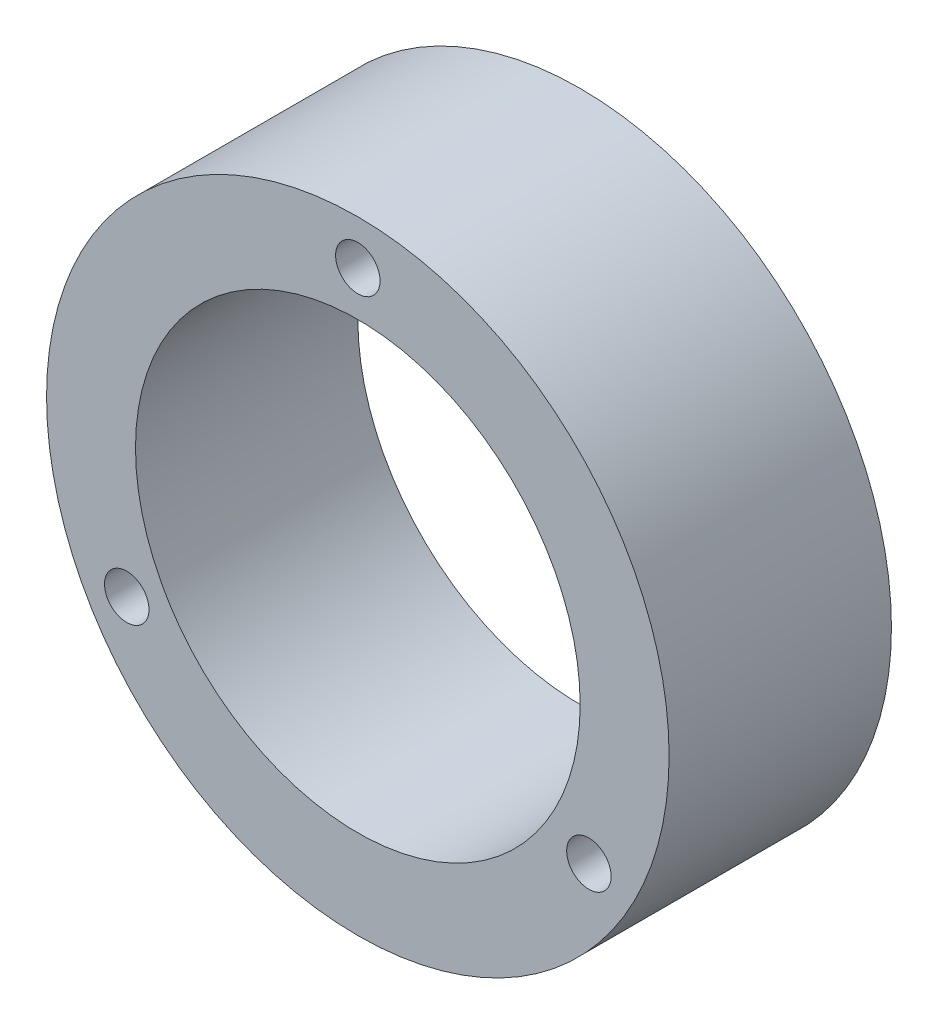
ISO-10303-21;
HEADER;
FILE_DESCRIPTION(('STEP AP214'),'2;1');
FILE_NAME('part.step','',(''),(''),'','','');
FILE_SCHEMA(('AUTOMOTIVE_DESIGN { 1 0 10303 214 1 1 1 1 }'));
ENDSEC;
DATA;
#1=APPLICATION_CONTEXT('core data for automotive mechanical design processes');
#2=APPLICATION_PROTOCOL_DEFINITION('international standard','automotive_design',2000,#1);
#3=PRODUCT_CONTEXT('',#1,'mechanical');
#4=PRODUCT('Part','Part','',(#3));
#5=PRODUCT_RELATED_PRODUCT_CATEGORY('part','',(#4));
#6=PRODUCT_DEFINITION_FORMATION('','',#4);
#7=PRODUCT_DEFINITION_CONTEXT('part definition',#1,'design');
#8=PRODUCT_DEFINITION('design','',#6,#7);
#9=PRODUCT_DEFINITION_SHAPE('','',#8);
#10=(LENGTH_UNIT() NAMED_UNIT(*) SI_UNIT(.MILLI.,.METRE.));
#11=(NAMED_UNIT(*) PLANE_ANGLE_UNIT() SI_UNIT($,.RADIAN.));
#12=(NAMED_UNIT(*) SI_UNIT($,.STERADIAN.) SOLID_ANGLE_UNIT());
#13=UNCERTAINTY_MEASURE_WITH_UNIT(LENGTH_MEASURE(1.E-05),#10,'distance_accuracy_value','');
#14=(GEOMETRIC_REPRESENTATION_CONTEXT(3) GLOBAL_UNCERTAINTY_ASSIGNED_CONTEXT((#13)) GLOBAL_UNIT_ASSIGNED_CONTEXT((#10,
#11,#12)) REPRESENTATION_CONTEXT('',''));
#15=CARTESIAN_POINT('',(0.,0.,0.));
#16=DIRECTION('',(0.,0.,1.));
#17=DIRECTION('',(1.,0.,0.));
#18=AXIS2_PLACEMENT_3D('',#15,#16,#17);
#19=CARTESIAN_POINT('',(0.,0.,2.25));
#20=DIRECTION('',(0.,0.,1.));
#21=DIRECTION('',(1.,0.,0.));
#22=AXIS2_PLACEMENT_3D('',#19,#20,#21);
#23=PLANE('',#22);
#24=CARTESIAN_POINT('',(0.,3.00000000000012,2.25));
#25=DIRECTION('',(0.,0.,-1.));
#26=DIRECTION('',(-1.,0.,0.));
#27=AXIS2_PLACEMENT_3D('',#24,#25,#26);
#28=CIRCLE('',#27,0.25);
#29=CARTESIAN_POINT('',(-0.25,3.00000000000012,2.25));
#30=VERTEX_POINT('',#29);
#31=EDGE_CURVE('E55',#30,#30,#28,.T.);
#32=ORIENTED_EDGE('',*,*,#31,.T.);
#33=EDGE_LOOP('',(#32));
#34=FACE_BOUND('',#33,.T.);
#35=CARTESIAN_POINT('',(-2.59807621135361,-1.49999999999995,2.25));
#36=DIRECTION('',(0.,0.,-1.));
#37=DIRECTION('',(-1.,0.,0.));
#38=AXIS2_PLACEMENT_3D('',#35,#36,#37);
#39=CIRCLE('',#38,0.250000000000164);
#40=CARTESIAN_POINT('',(-2.84807621135378,-1.49999999999995,2.25));
#41=VERTEX_POINT('',#40);
#42=EDGE_CURVE('E64',#41,#41,#39,.T.);
#43=ORIENTED_EDGE('',*,*,#42,.T.);
#44=EDGE_LOOP('',(#43));
#45=FACE_BOUND('',#44,.T.);
#46=CARTESIAN_POINT('',(2.59807621135323,-1.50000000000017,2.25));
#47=DIRECTION('',(0.,0.,-1.));
#48=DIRECTION('',(-1.,0.,0.));
#49=AXIS2_PLACEMENT_3D('',#46,#47,#48);
#50=CIRCLE('',#49,0.250000000000241);
#51=CARTESIAN_POINT('',(2.34807621135299,-1.50000000000017,2.25));
#52=VERTEX_POINT('',#51);
#53=EDGE_CURVE('E58',#52,#52,#50,.T.);
#54=ORIENTED_EDGE('',*,*,#53,.T.);
#55=EDGE_LOOP('',(#54));
#56=FACE_BOUND('',#55,.T.);
#57=CARTESIAN_POINT('',(0.,0.,2.25));
#58=DIRECTION('',(0.,0.,1.));
#59=DIRECTION('',(1.,0.,0.));
#60=AXIS2_PLACEMENT_3D('',#57,#58,#59);
#61=CIRCLE('',#60,3.50000000000012);
#62=CARTESIAN_POINT('',(3.50000000000012,0.,2.25));
#63=VERTEX_POINT('',#62);
#64=EDGE_CURVE('E10',#63,#63,#61,.T.);
#65=ORIENTED_EDGE('',*,*,#64,.T.);
#66=EDGE_LOOP('',(#65));
#67=FACE_BOUND('',#66,.T.);
#68=CARTESIAN_POINT('',(0.,0.,2.25));
#69=DIRECTION('',(0.,0.,1.));
#70=DIRECTION('',(1.,0.,0.));
#71=AXIS2_PLACEMENT_3D('',#68,#69,#70);
#72=CIRCLE('',#71,2.50000000000012);
#73=CARTESIAN_POINT('',(2.50000000000012,0.,2.25));
#74=VERTEX_POINT('',#73);
#75=EDGE_CURVE('E50',#74,#74,#72,.T.);
#76=ORIENTED_EDGE('',*,*,#75,.F.);
#77=EDGE_LOOP('',(#76));
#78=FACE_BOUND('',#77,.T.);
#79=ADVANCED_FACE('F39',(#34,#45,#56,#67,#78),#23,.T.);
#80=CARTESIAN_POINT('',(0.,0.,-0.250000000000002));
#81=DIRECTION('',(0.,0.,1.));
#82=DIRECTION('',(1.,0.,0.));
#83=AXIS2_PLACEMENT_3D('',#80,#81,#82);
#84=PLANE('',#83);
#85=CARTESIAN_POINT('',(0.,3.00000000000012,-0.250000000000002));
#86=DIRECTION('',(0.,0.,-1.));
#87=DIRECTION('',(-1.,0.,0.));
#88=AXIS2_PLACEMENT_3D('',#85,#86,#87);
#89=CIRCLE('',#88,0.25);
#90=CARTESIAN_POINT('',(-0.25,3.00000000000012,-0.250000000000002));
#91=VERTEX_POINT('',#90);
#92=EDGE_CURVE('E70',#91,#91,#89,.T.);
#93=ORIENTED_EDGE('',*,*,#92,.F.);
#94=EDGE_LOOP('',(#93));
#95=FACE_BOUND('',#94,.T.);
#96=CARTESIAN_POINT('',(-2.59807621135361,-1.49999999999995,-0.250000000000002));
#97=DIRECTION('',(0.,0.,-1.));
#98=DIRECTION('',(-1.,0.,0.));
#99=AXIS2_PLACEMENT_3D('',#96,#97,#98);
#100=CIRCLE('',#99,0.250000000000164);
#101=CARTESIAN_POINT('',(-2.84807621135378,-1.49999999999995,-0.250000000000002));
#102=VERTEX_POINT('',#101);
#103=EDGE_CURVE('E67',#102,#102,#100,.T.);
#104=ORIENTED_EDGE('',*,*,#103,.F.);
#105=EDGE_LOOP('',(#104));
#106=FACE_BOUND('',#105,.T.);
#107=CARTESIAN_POINT('',(2.59807621135323,-1.50000000000017,-0.250000000000002));
#108=DIRECTION('',(0.,0.,-1.));
#109=DIRECTION('',(-1.,0.,0.));
#110=AXIS2_PLACEMENT_3D('',#107,#108,#109);
#111=CIRCLE('',#110,0.250000000000241);
#112=CARTESIAN_POINT('',(2.34807621135299,-1.50000000000017,-0.250000000000002));
#113=VERTEX_POINT('',#112);
#114=EDGE_CURVE('E61',#113,#113,#111,.T.);
#115=ORIENTED_EDGE('',*,*,#114,.F.);
#116=EDGE_LOOP('',(#115));
#117=FACE_BOUND('',#116,.T.);
#118=CARTESIAN_POINT('',(0.,0.,-0.250000000000002));
#119=DIRECTION('',(0.,0.,1.));
#120=DIRECTION('',(1.,0.,0.));
#121=AXIS2_PLACEMENT_3D('',#118,#119,#120);
#122=CIRCLE('',#121,3.50000000000012);
#123=CARTESIAN_POINT('',(3.50000000000012,0.,-0.250000000000002));
#124=VERTEX_POINT('',#123);
#125=EDGE_CURVE('E43',#124,#124,#122,.T.);
#126=ORIENTED_EDGE('',*,*,#125,.F.);
#127=EDGE_LOOP('',(#126));
#128=FACE_BOUND('',#127,.T.);
#129=CARTESIAN_POINT('',(0.,0.,-0.250000000000002));
#130=DIRECTION('',(0.,0.,1.));
#131=DIRECTION('',(1.,0.,0.));
#132=AXIS2_PLACEMENT_3D('',#129,#130,#131);
#133=CIRCLE('',#132,2.50000000000012);
#134=CARTESIAN_POINT('',(2.50000000000012,0.,-0.250000000000002));
#135=VERTEX_POINT('',#134);
#136=EDGE_CURVE('E52',#135,#135,#133,.T.);
#137=ORIENTED_EDGE('',*,*,#136,.T.);
#138=EDGE_LOOP('',(#137));
#139=FACE_BOUND('',#138,.T.);
#140=ADVANCED_FACE('F85',(#95,#106,#117,#128,#139),#84,.F.);
#141=CARTESIAN_POINT('',(0.,0.,2.25));
#142=DIRECTION('',(0.,0.,-1.));
#143=DIRECTION('',(-1.,0.,0.));
#144=AXIS2_PLACEMENT_3D('',#141,#142,#143);
#145=CYLINDRICAL_SURFACE('',#144,3.50000000000012);
#146=ORIENTED_EDGE('',*,*,#64,.F.);
#147=EDGE_LOOP('',(#146));
#148=FACE_BOUND('',#147,.T.);
#149=ORIENTED_EDGE('',*,*,#125,.T.);
#150=EDGE_LOOP('',(#149));
#151=FACE_BOUND('',#150,.T.);
#152=ADVANCED_FACE('F41',(#148,#151),#145,.T.);
#153=CARTESIAN_POINT('',(0.,0.,2.25));
#154=DIRECTION('',(0.,0.,-1.));
#155=DIRECTION('',(-1.,0.,0.));
#156=AXIS2_PLACEMENT_3D('',#153,#154,#155);
#157=CYLINDRICAL_SURFACE('',#156,2.50000000000012);
#158=ORIENTED_EDGE('',*,*,#75,.T.);
#159=EDGE_LOOP('',(#158));
#160=FACE_BOUND('',#159,.T.);
#161=ORIENTED_EDGE('',*,*,#136,.F.);
#162=EDGE_LOOP('',(#161));
#163=FACE_BOUND('',#162,.T.);
#164=ADVANCED_FACE('F96',(#160,#163),#157,.F.);
#165=CARTESIAN_POINT('',(2.59807621135323,-1.50000000000017,2.25));
#166=DIRECTION('',(0.,0.,-1.));
#167=DIRECTION('',(-1.,0.,0.));
#168=AXIS2_PLACEMENT_3D('',#165,#166,#167);
#169=CYLINDRICAL_SURFACE('',#168,0.250000000000241);
#170=ORIENTED_EDGE('',*,*,#53,.F.);
#171=EDGE_LOOP('',(#170));
#172=FACE_BOUND('',#171,.T.);
#173=ORIENTED_EDGE('',*,*,#114,.T.);
#174=EDGE_LOOP('',(#173));
#175=FACE_BOUND('',#174,.T.);
#176=ADVANCED_FACE('F98',(#172,#175),#169,.F.);
#177=CARTESIAN_POINT('',(-2.59807621135361,-1.49999999999995,2.25));
#178=DIRECTION('',(0.,0.,-1.));
#179=DIRECTION('',(-1.,0.,0.));
#180=AXIS2_PLACEMENT_3D('',#177,#178,#179);
#181=CYLINDRICAL_SURFACE('',#180,0.250000000000164);
#182=ORIENTED_EDGE('',*,*,#42,.F.);
#183=EDGE_LOOP('',(#182));
#184=FACE_BOUND('',#183,.T.);
#185=ORIENTED_EDGE('',*,*,#103,.T.);
#186=EDGE_LOOP('',(#185));
#187=FACE_BOUND('',#186,.T.);
#188=ADVANCED_FACE('F81',(#184,#187),#181,.F.);
#189=CARTESIAN_POINT('',(0.,3.00000000000012,2.25));
#190=DIRECTION('',(0.,0.,-1.));
#191=DIRECTION('',(-1.,0.,0.));
#192=AXIS2_PLACEMENT_3D('',#189,#190,#191);
#193=CYLINDRICAL_SURFACE('',#192,0.25);
#194=ORIENTED_EDGE('',*,*,#31,.F.);
#195=EDGE_LOOP('',(#194));
#196=FACE_BOUND('',#195,.T.);
#197=ORIENTED_EDGE('',*,*,#92,.T.);
#198=EDGE_LOOP('',(#197));
#199=FACE_BOUND('',#198,.T.);
#200=ADVANCED_FACE('F78',(#196,#199),#193,.F.);
#201=CLOSED_SHELL('',(#79,#140,#152,#164,#176,#188,#200));
#202=MANIFOLD_SOLID_BREP('B2',#201);
#203=ADVANCED_BREP_SHAPE_REPRESENTATION('',(#18,#202),#14);
#204=SHAPE_DEFINITION_REPRESENTATION(#9,#203);
ENDSEC;
END-ISO-10303-21;
